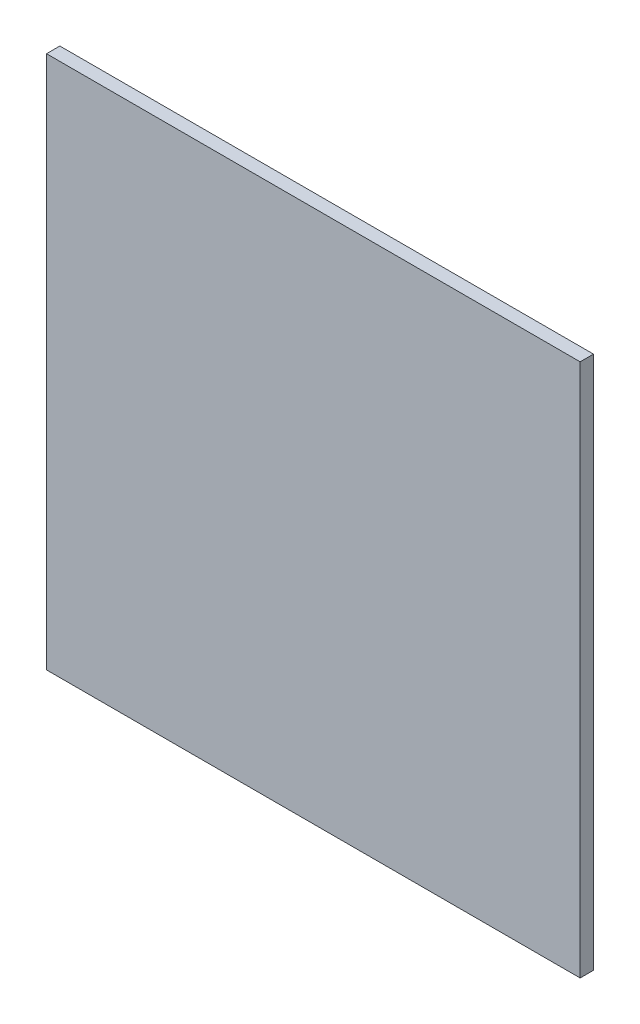
ISO-10303-21;
HEADER;
FILE_DESCRIPTION(('STEP AP214'),'2;1');
FILE_NAME('part.step','',(''),(''),'','','');
FILE_SCHEMA(('AUTOMOTIVE_DESIGN { 1 0 10303 214 1 1 1 1 }'));
ENDSEC;
DATA;
#1=APPLICATION_CONTEXT('core data for automotive mechanical design processes');
#2=APPLICATION_PROTOCOL_DEFINITION('international standard','automotive_design',2000,#1);
#3=PRODUCT_CONTEXT('',#1,'mechanical');
#4=PRODUCT('Part','Part','',(#3));
#5=PRODUCT_RELATED_PRODUCT_CATEGORY('part','',(#4));
#6=PRODUCT_DEFINITION_FORMATION('','',#4);
#7=PRODUCT_DEFINITION_CONTEXT('part definition',#1,'design');
#8=PRODUCT_DEFINITION('design','',#6,#7);
#9=PRODUCT_DEFINITION_SHAPE('','',#8);
#10=(LENGTH_UNIT() NAMED_UNIT(*) SI_UNIT(.MILLI.,.METRE.));
#11=(NAMED_UNIT(*) PLANE_ANGLE_UNIT() SI_UNIT($,.RADIAN.));
#12=(NAMED_UNIT(*) SI_UNIT($,.STERADIAN.) SOLID_ANGLE_UNIT());
#13=UNCERTAINTY_MEASURE_WITH_UNIT(LENGTH_MEASURE(1.E-05),#10,'distance_accuracy_value','');
#14=(GEOMETRIC_REPRESENTATION_CONTEXT(3) GLOBAL_UNCERTAINTY_ASSIGNED_CONTEXT((#13)) GLOBAL_UNIT_ASSIGNED_CONTEXT((#10,
#11,#12)) REPRESENTATION_CONTEXT('',''));
#15=CARTESIAN_POINT('',(0.,0.,0.));
#16=DIRECTION('',(0.,0.,1.));
#17=DIRECTION('',(1.,0.,0.));
#18=AXIS2_PLACEMENT_3D('',#15,#16,#17);
#19=CARTESIAN_POINT('',(0.,0.,0.5));
#20=DIRECTION('',(1.,0.,0.));
#21=DIRECTION('',(0.,0.,-1.));
#22=AXIS2_PLACEMENT_3D('',#19,#20,#21);
#23=PLANE('',#22);
#24=DIRECTION('',(0.,-1.,0.));
#25=VECTOR('',#24,1.);
#26=CARTESIAN_POINT('',(0.,0.,0.));
#27=LINE('',#26,#25);
#28=CARTESIAN_POINT('',(0.,20.,0.));
#29=VERTEX_POINT('',#28);
#30=CARTESIAN_POINT('',(0.,0.,0.));
#31=VERTEX_POINT('',#30);
#32=EDGE_CURVE('E98',#29,#31,#27,.T.);
#33=ORIENTED_EDGE('',*,*,#32,.T.);
#34=DIRECTION('',(0.,0.,-1.));
#35=VECTOR('',#34,1.);
#36=CARTESIAN_POINT('',(0.,0.,0.5));
#37=LINE('',#36,#35);
#38=CARTESIAN_POINT('',(0.,0.,0.5));
#39=VERTEX_POINT('',#38);
#40=EDGE_CURVE('E11',#39,#31,#37,.T.);
#41=ORIENTED_EDGE('',*,*,#40,.F.);
#42=DIRECTION('',(0.,-1.,0.));
#43=VECTOR('',#42,1.);
#44=CARTESIAN_POINT('',(0.,0.,0.5));
#45=LINE('',#44,#43);
#46=CARTESIAN_POINT('',(0.,20.,0.5));
#47=VERTEX_POINT('',#46);
#48=EDGE_CURVE('E86',#47,#39,#45,.T.);
#49=ORIENTED_EDGE('',*,*,#48,.F.);
#50=DIRECTION('',(0.,0.,-1.));
#51=VECTOR('',#50,1.);
#52=CARTESIAN_POINT('',(0.,20.,0.5));
#53=LINE('',#52,#51);
#54=EDGE_CURVE('E94',#47,#29,#53,.T.);
#55=ORIENTED_EDGE('',*,*,#54,.T.);
#56=EDGE_LOOP('',(#33,#41,#49,#55));
#57=FACE_BOUND('',#56,.T.);
#58=ADVANCED_FACE('F35',(#57),#23,.F.);
#59=CARTESIAN_POINT('',(0.,0.,0.5));
#60=DIRECTION('',(0.,1.,0.));
#61=DIRECTION('',(0.,0.,1.));
#62=AXIS2_PLACEMENT_3D('',#59,#60,#61);
#63=PLANE('',#62);
#64=DIRECTION('',(1.,0.,0.));
#65=VECTOR('',#64,1.);
#66=CARTESIAN_POINT('',(0.,0.,0.));
#67=LINE('',#66,#65);
#68=CARTESIAN_POINT('',(20.,0.,0.));
#69=VERTEX_POINT('',#68);
#70=EDGE_CURVE('E90',#31,#69,#67,.T.);
#71=ORIENTED_EDGE('',*,*,#70,.T.);
#72=DIRECTION('',(0.,0.,-1.));
#73=VECTOR('',#72,1.);
#74=CARTESIAN_POINT('',(20.,0.,0.5));
#75=LINE('',#74,#73);
#76=CARTESIAN_POINT('',(20.,0.,0.5));
#77=VERTEX_POINT('',#76);
#78=EDGE_CURVE('E43',#77,#69,#75,.T.);
#79=ORIENTED_EDGE('',*,*,#78,.F.);
#80=DIRECTION('',(1.,0.,0.));
#81=VECTOR('',#80,1.);
#82=CARTESIAN_POINT('',(0.,0.,0.5));
#83=LINE('',#82,#81);
#84=EDGE_CURVE('E81',#39,#77,#83,.T.);
#85=ORIENTED_EDGE('',*,*,#84,.F.);
#86=ORIENTED_EDGE('',*,*,#40,.T.);
#87=EDGE_LOOP('',(#71,#79,#85,#86));
#88=FACE_BOUND('',#87,.T.);
#89=ADVANCED_FACE('F89',(#88),#63,.F.);
#90=CARTESIAN_POINT('',(20.,0.,0.5));
#91=DIRECTION('',(-1.,0.,0.));
#92=DIRECTION('',(0.,0.,1.));
#93=AXIS2_PLACEMENT_3D('',#90,#91,#92);
#94=PLANE('',#93);
#95=DIRECTION('',(0.,1.,0.));
#96=VECTOR('',#95,1.);
#97=CARTESIAN_POINT('',(20.,0.,0.));
#98=LINE('',#97,#96);
#99=CARTESIAN_POINT('',(20.,20.,0.));
#100=VERTEX_POINT('',#99);
#101=EDGE_CURVE('E68',#69,#100,#98,.T.);
#102=ORIENTED_EDGE('',*,*,#101,.T.);
#103=DIRECTION('',(0.,0.,-1.));
#104=VECTOR('',#103,1.);
#105=CARTESIAN_POINT('',(20.,20.,0.5));
#106=LINE('',#105,#104);
#107=CARTESIAN_POINT('',(20.,20.,0.5));
#108=VERTEX_POINT('',#107);
#109=EDGE_CURVE('E91',#108,#100,#106,.T.);
#110=ORIENTED_EDGE('',*,*,#109,.F.);
#111=DIRECTION('',(0.,1.,0.));
#112=VECTOR('',#111,1.);
#113=CARTESIAN_POINT('',(20.,0.,0.5));
#114=LINE('',#113,#112);
#115=EDGE_CURVE('E84',#77,#108,#114,.T.);
#116=ORIENTED_EDGE('',*,*,#115,.F.);
#117=ORIENTED_EDGE('',*,*,#78,.T.);
#118=EDGE_LOOP('',(#102,#110,#116,#117));
#119=FACE_BOUND('',#118,.T.);
#120=ADVANCED_FACE('F92',(#119),#94,.F.);
#121=CARTESIAN_POINT('',(0.,20.,0.5));
#122=DIRECTION('',(0.,-1.,0.));
#123=DIRECTION('',(0.,0.,-1.));
#124=AXIS2_PLACEMENT_3D('',#121,#122,#123);
#125=PLANE('',#124);
#126=DIRECTION('',(-1.,0.,0.));
#127=VECTOR('',#126,1.);
#128=CARTESIAN_POINT('',(0.,20.,0.));
#129=LINE('',#128,#127);
#130=EDGE_CURVE('E74',#100,#29,#129,.T.);
#131=ORIENTED_EDGE('',*,*,#130,.T.);
#132=ORIENTED_EDGE('',*,*,#54,.F.);
#133=DIRECTION('',(-1.,0.,0.));
#134=VECTOR('',#133,1.);
#135=CARTESIAN_POINT('',(0.,20.,0.5));
#136=LINE('',#135,#134);
#137=EDGE_CURVE('E51',#108,#47,#136,.T.);
#138=ORIENTED_EDGE('',*,*,#137,.F.);
#139=ORIENTED_EDGE('',*,*,#109,.T.);
#140=EDGE_LOOP('',(#131,#132,#138,#139));
#141=FACE_BOUND('',#140,.T.);
#142=ADVANCED_FACE('F105',(#141),#125,.F.);
#143=CARTESIAN_POINT('',(0.,0.,0.5));
#144=DIRECTION('',(0.,0.,-1.));
#145=DIRECTION('',(-1.,0.,0.));
#146=AXIS2_PLACEMENT_3D('',#143,#144,#145);
#147=PLANE('',#146);
#148=ORIENTED_EDGE('',*,*,#48,.T.);
#149=ORIENTED_EDGE('',*,*,#84,.T.);
#150=ORIENTED_EDGE('',*,*,#115,.T.);
#151=ORIENTED_EDGE('',*,*,#137,.T.);
#152=EDGE_LOOP('',(#148,#149,#150,#151));
#153=FACE_BOUND('',#152,.T.);
#154=ADVANCED_FACE('F82',(#153),#147,.F.);
#155=CARTESIAN_POINT('',(0.,0.,0.));
#156=DIRECTION('',(0.,0.,-1.));
#157=DIRECTION('',(-1.,0.,0.));
#158=AXIS2_PLACEMENT_3D('',#155,#156,#157);
#159=PLANE('',#158);
#160=ORIENTED_EDGE('',*,*,#32,.F.);
#161=ORIENTED_EDGE('',*,*,#130,.F.);
#162=ORIENTED_EDGE('',*,*,#101,.F.);
#163=ORIENTED_EDGE('',*,*,#70,.F.);
#164=EDGE_LOOP('',(#160,#161,#162,#163));
#165=FACE_BOUND('',#164,.T.);
#166=ADVANCED_FACE('F108',(#165),#159,.T.);
#167=CLOSED_SHELL('',(#58,#89,#120,#142,#154,#166));
#168=MANIFOLD_SOLID_BREP('B2',#167);
#169=ADVANCED_BREP_SHAPE_REPRESENTATION('',(#18,#168),#14);
#170=SHAPE_DEFINITION_REPRESENTATION(#9,#169);
ENDSEC;
END-ISO-10303-21;
